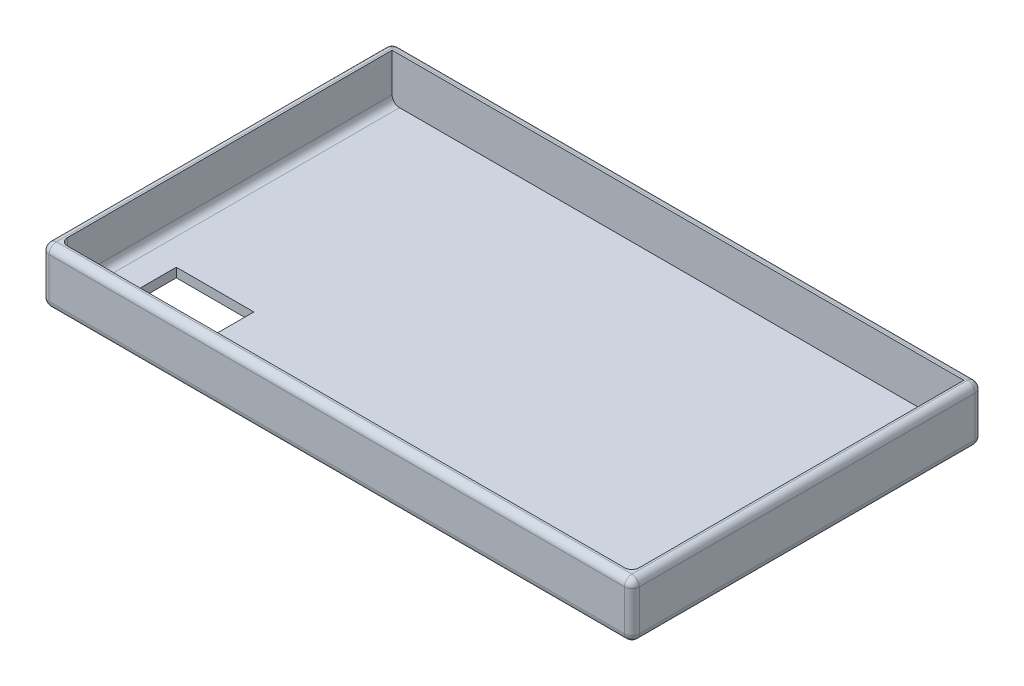
ISO-10303-21;
HEADER;
FILE_DESCRIPTION(('STEP AP214'),'2;1');
FILE_NAME('part.step','',(''),(''),'','','');
FILE_SCHEMA(('AUTOMOTIVE_DESIGN { 1 0 10303 214 1 1 1 1 }'));
ENDSEC;
DATA;
#1=APPLICATION_CONTEXT('core data for automotive mechanical design processes');
#2=APPLICATION_PROTOCOL_DEFINITION('international standard','automotive_design',2000,#1);
#3=PRODUCT_CONTEXT('',#1,'mechanical');
#4=PRODUCT('Part','Part','',(#3));
#5=PRODUCT_RELATED_PRODUCT_CATEGORY('part','',(#4));
#6=PRODUCT_DEFINITION_FORMATION('','',#4);
#7=PRODUCT_DEFINITION_CONTEXT('part definition',#1,'design');
#8=PRODUCT_DEFINITION('design','',#6,#7);
#9=PRODUCT_DEFINITION_SHAPE('','',#8);
#10=(LENGTH_UNIT() NAMED_UNIT(*) SI_UNIT(.MILLI.,.METRE.));
#11=(NAMED_UNIT(*) PLANE_ANGLE_UNIT() SI_UNIT($,.RADIAN.));
#12=(NAMED_UNIT(*) SI_UNIT($,.STERADIAN.) SOLID_ANGLE_UNIT());
#13=UNCERTAINTY_MEASURE_WITH_UNIT(LENGTH_MEASURE(1.E-05),#10,'distance_accuracy_value','');
#14=(GEOMETRIC_REPRESENTATION_CONTEXT(3) GLOBAL_UNCERTAINTY_ASSIGNED_CONTEXT((#13)) GLOBAL_UNIT_ASSIGNED_CONTEXT((#10,
#11,#12)) REPRESENTATION_CONTEXT('',''));
#15=CARTESIAN_POINT('',(0.,0.,0.));
#16=DIRECTION('',(0.,0.,1.));
#17=DIRECTION('',(1.,0.,0.));
#18=AXIS2_PLACEMENT_3D('',#15,#16,#17);
#19=CARTESIAN_POINT('',(0.,0.,0.));
#20=DIRECTION('',(0.,1.,0.));
#21=DIRECTION('',(0.,0.,1.));
#22=AXIS2_PLACEMENT_3D('',#19,#20,#21);
#23=PLANE('',#22);
#24=DIRECTION('',(0.,0.,-1.));
#25=VECTOR('',#24,1.);
#26=CARTESIAN_POINT('',(83.6859504132231,0.,0.));
#27=LINE('',#26,#25);
#28=CARTESIAN_POINT('',(83.6859504132231,0.,-42.4297520661157));
#29=VERTEX_POINT('',#28);
#30=CARTESIAN_POINT('',(83.6859504132231,0.,48.5702479338843));
#31=VERTEX_POINT('',#30);
#32=EDGE_CURVE('E284',#29,#31,#27,.F.);
#33=ORIENTED_EDGE('',*,*,#32,.T.);
#34=DIRECTION('',(1.,0.,0.));
#35=VECTOR('',#34,1.);
#36=CARTESIAN_POINT('',(0.,0.,48.5702479338843));
#37=LINE('',#36,#35);
#38=CARTESIAN_POINT('',(-72.3140495867769,0.,48.5702479338843));
#39=VERTEX_POINT('',#38);
#40=EDGE_CURVE('E292',#31,#39,#37,.F.);
#41=ORIENTED_EDGE('',*,*,#40,.T.);
#42=DIRECTION('',(0.,0.,1.));
#43=VECTOR('',#42,1.);
#44=CARTESIAN_POINT('',(-72.3140495867769,0.,0.));
#45=LINE('',#44,#43);
#46=CARTESIAN_POINT('',(-72.3140495867769,0.,-42.4297520661157));
#47=VERTEX_POINT('',#46);
#48=EDGE_CURVE('E288',#39,#47,#45,.F.);
#49=ORIENTED_EDGE('',*,*,#48,.T.);
#50=DIRECTION('',(-1.,0.,0.));
#51=VECTOR('',#50,1.);
#52=CARTESIAN_POINT('',(0.,0.,-42.4297520661157));
#53=LINE('',#52,#51);
#54=EDGE_CURVE('E290',#47,#29,#53,.F.);
#55=ORIENTED_EDGE('',*,*,#54,.T.);
#56=EDGE_LOOP('',(#33,#41,#49,#55));
#57=FACE_BOUND('',#56,.T.);
#58=DIRECTION('',(0.,0.,1.));
#59=VECTOR('',#58,1.);
#60=CARTESIAN_POINT('',(-62.6037619131865,0.,25.7770009158667));
#61=LINE('',#60,#59);
#62=CARTESIAN_POINT('',(-62.6037619131865,0.,25.7770009158667));
#63=VERTEX_POINT('',#62);
#64=CARTESIAN_POINT('',(-62.6037619131865,0.,38.7770009158667));
#65=VERTEX_POINT('',#64);
#66=EDGE_CURVE('E209',#63,#65,#61,.T.);
#67=ORIENTED_EDGE('',*,*,#66,.T.);
#68=DIRECTION('',(1.,0.,0.));
#69=VECTOR('',#68,1.);
#70=CARTESIAN_POINT('',(-62.6037619131865,0.,38.7770009158667));
#71=LINE('',#70,#69);
#72=CARTESIAN_POINT('',(-41.6037619131865,0.,38.7770009158667));
#73=VERTEX_POINT('',#72);
#74=EDGE_CURVE('E219',#65,#73,#71,.T.);
#75=ORIENTED_EDGE('',*,*,#74,.T.);
#76=DIRECTION('',(0.,0.,-1.));
#77=VECTOR('',#76,1.);
#78=CARTESIAN_POINT('',(-41.6037619131865,0.,25.7770009158667));
#79=LINE('',#78,#77);
#80=CARTESIAN_POINT('',(-41.6037619131865,0.,25.7770009158667));
#81=VERTEX_POINT('',#80);
#82=EDGE_CURVE('E228',#73,#81,#79,.T.);
#83=ORIENTED_EDGE('',*,*,#82,.T.);
#84=DIRECTION('',(-1.,0.,0.));
#85=VECTOR('',#84,1.);
#86=CARTESIAN_POINT('',(-62.6037619131865,0.,25.7770009158667));
#87=LINE('',#86,#85);
#88=EDGE_CURVE('E227',#81,#63,#87,.T.);
#89=ORIENTED_EDGE('',*,*,#88,.T.);
#90=EDGE_LOOP('',(#67,#75,#83,#89));
#91=FACE_BOUND('',#90,.T.);
#92=ADVANCED_FACE('F44',(#57,#91),#23,.F.);
#93=CARTESIAN_POINT('',(0.,2.5,0.));
#94=DIRECTION('',(0.,1.,0.));
#95=DIRECTION('',(0.,0.,1.));
#96=AXIS2_PLACEMENT_3D('',#93,#94,#95);
#97=PLANE('',#96);
#98=DIRECTION('',(1.,0.,0.));
#99=VECTOR('',#98,1.);
#100=CARTESIAN_POINT('',(83.1859504132231,2.5,46.0702479338843));
#101=LINE('',#100,#99);
#102=CARTESIAN_POINT('',(-69.8140495867769,2.5,46.0702479338843));
#103=VERTEX_POINT('',#102);
#104=CARTESIAN_POINT('',(81.1859504132231,2.5,46.0702479338843));
#105=VERTEX_POINT('',#104);
#106=EDGE_CURVE('E65',#103,#105,#101,.T.);
#107=ORIENTED_EDGE('',*,*,#106,.T.);
#108=DIRECTION('',(0.,0.,-1.));
#109=VECTOR('',#108,1.);
#110=CARTESIAN_POINT('',(81.1859504132231,2.5,-41.9297520661157));
#111=LINE('',#110,#109);
#112=CARTESIAN_POINT('',(81.1859504132231,2.5,-41.9297520661157));
#113=VERTEX_POINT('',#112);
#114=EDGE_CURVE('E66',#105,#113,#111,.T.);
#115=ORIENTED_EDGE('',*,*,#114,.T.);
#116=DIRECTION('',(-1.,0.,0.));
#117=VECTOR('',#116,1.);
#118=CARTESIAN_POINT('',(-74.3140495867769,2.5,-41.9297520661157));
#119=LINE('',#118,#117);
#120=CARTESIAN_POINT('',(-69.8140495867769,2.5,-41.9297520661157));
#121=VERTEX_POINT('',#120);
#122=EDGE_CURVE('E216',#113,#121,#119,.T.);
#123=ORIENTED_EDGE('',*,*,#122,.T.);
#124=DIRECTION('',(0.,0.,1.));
#125=VECTOR('',#124,1.);
#126=CARTESIAN_POINT('',(-69.8140495867769,2.5,48.0702479338843));
#127=LINE('',#126,#125);
#128=EDGE_CURVE('E357',#121,#103,#127,.T.);
#129=ORIENTED_EDGE('',*,*,#128,.T.);
#130=EDGE_LOOP('',(#107,#115,#123,#129));
#131=FACE_BOUND('',#130,.T.);
#132=DIRECTION('',(-1.,0.,0.));
#133=VECTOR('',#132,1.);
#134=CARTESIAN_POINT('',(0.,2.5,38.7770009158667));
#135=LINE('',#134,#133);
#136=CARTESIAN_POINT('',(-41.6037619131865,2.5,38.7770009158667));
#137=VERTEX_POINT('',#136);
#138=CARTESIAN_POINT('',(-62.6037619131865,2.5,38.7770009158667));
#139=VERTEX_POINT('',#138);
#140=EDGE_CURVE('E270',#137,#139,#135,.T.);
#141=ORIENTED_EDGE('',*,*,#140,.T.);
#142=DIRECTION('',(0.,0.,-1.));
#143=VECTOR('',#142,1.);
#144=CARTESIAN_POINT('',(-62.6037619131865,2.5,0.));
#145=LINE('',#144,#143);
#146=CARTESIAN_POINT('',(-62.6037619131865,2.5,25.7770009158667));
#147=VERTEX_POINT('',#146);
#148=EDGE_CURVE('E213',#139,#147,#145,.T.);
#149=ORIENTED_EDGE('',*,*,#148,.T.);
#150=DIRECTION('',(1.,0.,0.));
#151=VECTOR('',#150,1.);
#152=CARTESIAN_POINT('',(0.,2.5,25.7770009158667));
#153=LINE('',#152,#151);
#154=CARTESIAN_POINT('',(-41.6037619131865,2.5,25.7770009158667));
#155=VERTEX_POINT('',#154);
#156=EDGE_CURVE('E253',#147,#155,#153,.T.);
#157=ORIENTED_EDGE('',*,*,#156,.T.);
#158=DIRECTION('',(0.,0.,1.));
#159=VECTOR('',#158,1.);
#160=CARTESIAN_POINT('',(-41.6037619131865,2.5,0.));
#161=LINE('',#160,#159);
#162=EDGE_CURVE('E262',#155,#137,#161,.T.);
#163=ORIENTED_EDGE('',*,*,#162,.T.);
#164=EDGE_LOOP('',(#141,#149,#157,#163));
#165=FACE_BOUND('',#164,.T.);
#166=ADVANCED_FACE('F475',(#131,#165),#97,.T.);
#167=CARTESIAN_POINT('',(-74.3140495867769,15.,-44.4297520661157));
#168=DIRECTION('',(1.,0.,0.));
#169=DIRECTION('',(0.,0.,-1.));
#170=AXIS2_PLACEMENT_3D('',#167,#168,#169);
#171=PLANE('',#170);
#172=DIRECTION('',(0.,0.,1.));
#173=VECTOR('',#172,1.);
#174=CARTESIAN_POINT('',(-74.3140495867769,2.,-44.4297520661157));
#175=LINE('',#174,#173);
#176=CARTESIAN_POINT('',(-74.3140495867769,2.,-42.4297520661157));
#177=VERTEX_POINT('',#176);
#178=CARTESIAN_POINT('',(-74.3140495867769,2.,48.5702479338843));
#179=VERTEX_POINT('',#178);
#180=EDGE_CURVE('E280',#177,#179,#175,.T.);
#181=ORIENTED_EDGE('',*,*,#180,.T.);
#182=DIRECTION('',(0.,-1.,0.));
#183=VECTOR('',#182,1.);
#184=CARTESIAN_POINT('',(-74.3140495867769,15.,48.5702479338843));
#185=LINE('',#184,#183);
#186=CARTESIAN_POINT('',(-74.3140495867769,13.,48.5702479338843));
#187=VERTEX_POINT('',#186);
#188=EDGE_CURVE('E283',#179,#187,#185,.F.);
#189=ORIENTED_EDGE('',*,*,#188,.T.);
#190=DIRECTION('',(0.,0.,1.));
#191=VECTOR('',#190,1.);
#192=CARTESIAN_POINT('',(-74.3140495867769,13.,-44.4297520661157));
#193=LINE('',#192,#191);
#194=CARTESIAN_POINT('',(-74.3140495867769,13.,-42.4297520661157));
#195=VERTEX_POINT('',#194);
#196=EDGE_CURVE('E276',#187,#195,#193,.F.);
#197=ORIENTED_EDGE('',*,*,#196,.T.);
#198=DIRECTION('',(0.,-1.,0.));
#199=VECTOR('',#198,1.);
#200=CARTESIAN_POINT('',(-74.3140495867769,15.,-42.4297520661157));
#201=LINE('',#200,#199);
#202=EDGE_CURVE('E274',#195,#177,#201,.T.);
#203=ORIENTED_EDGE('',*,*,#202,.T.);
#204=EDGE_LOOP('',(#181,#189,#197,#203));
#205=FACE_BOUND('',#204,.T.);
#206=ADVANCED_FACE('F477',(#205),#171,.F.);
#207=CARTESIAN_POINT('',(-74.3140495867769,15.,50.5702479338843));
#208=DIRECTION('',(0.,0.,-1.));
#209=DIRECTION('',(-1.,0.,0.));
#210=AXIS2_PLACEMENT_3D('',#207,#208,#209);
#211=PLANE('',#210);
#212=DIRECTION('',(0.,-1.,0.));
#213=VECTOR('',#212,1.);
#214=CARTESIAN_POINT('',(83.6859504132231,15.,50.5702479338843));
#215=LINE('',#214,#213);
#216=CARTESIAN_POINT('',(83.6859504132231,2.,50.5702479338843));
#217=VERTEX_POINT('',#216);
#218=CARTESIAN_POINT('',(83.6859504132231,13.,50.5702479338843));
#219=VERTEX_POINT('',#218);
#220=EDGE_CURVE('E369',#217,#219,#215,.F.);
#221=ORIENTED_EDGE('',*,*,#220,.T.);
#222=DIRECTION('',(1.,0.,0.));
#223=VECTOR('',#222,1.);
#224=CARTESIAN_POINT('',(-72.3140495867769,13.,50.5702479338843));
#225=LINE('',#224,#223);
#226=CARTESIAN_POINT('',(-72.3140495867769,13.,50.5702479338843));
#227=VERTEX_POINT('',#226);
#228=EDGE_CURVE('E371',#219,#227,#225,.F.);
#229=ORIENTED_EDGE('',*,*,#228,.T.);
#230=DIRECTION('',(0.,-1.,0.));
#231=VECTOR('',#230,1.);
#232=CARTESIAN_POINT('',(-72.3140495867769,15.,50.5702479338843));
#233=LINE('',#232,#231);
#234=CARTESIAN_POINT('',(-72.3140495867769,2.,50.5702479338843));
#235=VERTEX_POINT('',#234);
#236=EDGE_CURVE('E272',#227,#235,#233,.T.);
#237=ORIENTED_EDGE('',*,*,#236,.T.);
#238=DIRECTION('',(1.,0.,0.));
#239=VECTOR('',#238,1.);
#240=CARTESIAN_POINT('',(-74.3140495867769,2.,50.5702479338843));
#241=LINE('',#240,#239);
#242=EDGE_CURVE('E269',#235,#217,#241,.T.);
#243=ORIENTED_EDGE('',*,*,#242,.T.);
#244=EDGE_LOOP('',(#221,#229,#237,#243));
#245=FACE_BOUND('',#244,.T.);
#246=ADVANCED_FACE('F491',(#245),#211,.F.);
#247=CARTESIAN_POINT('',(85.6859504132231,15.,-44.4297520661157));
#248=DIRECTION('',(-1.,0.,0.));
#249=DIRECTION('',(0.,0.,1.));
#250=AXIS2_PLACEMENT_3D('',#247,#248,#249);
#251=PLANE('',#250);
#252=DIRECTION('',(0.,0.,-1.));
#253=VECTOR('',#252,1.);
#254=CARTESIAN_POINT('',(85.6859504132231,13.,50.5702479338843));
#255=LINE('',#254,#253);
#256=CARTESIAN_POINT('',(85.6859504132231,13.,-42.4297520661157));
#257=VERTEX_POINT('',#256);
#258=CARTESIAN_POINT('',(85.6859504132231,13.,48.5702479338843));
#259=VERTEX_POINT('',#258);
#260=EDGE_CURVE('E373',#257,#259,#255,.F.);
#261=ORIENTED_EDGE('',*,*,#260,.T.);
#262=DIRECTION('',(0.,-1.,0.));
#263=VECTOR('',#262,1.);
#264=CARTESIAN_POINT('',(85.6859504132231,15.,48.5702479338843));
#265=LINE('',#264,#263);
#266=CARTESIAN_POINT('',(85.6859504132231,2.,48.5702479338843));
#267=VERTEX_POINT('',#266);
#268=EDGE_CURVE('E374',#259,#267,#265,.T.);
#269=ORIENTED_EDGE('',*,*,#268,.T.);
#270=DIRECTION('',(0.,0.,-1.));
#271=VECTOR('',#270,1.);
#272=CARTESIAN_POINT('',(85.6859504132231,2.,-44.4297520661157));
#273=LINE('',#272,#271);
#274=CARTESIAN_POINT('',(85.6859504132231,2.,-42.4297520661157));
#275=VERTEX_POINT('',#274);
#276=EDGE_CURVE('E310',#267,#275,#273,.T.);
#277=ORIENTED_EDGE('',*,*,#276,.T.);
#278=DIRECTION('',(0.,-1.,0.));
#279=VECTOR('',#278,1.);
#280=CARTESIAN_POINT('',(85.6859504132231,15.,-42.4297520661157));
#281=LINE('',#280,#279);
#282=EDGE_CURVE('E313',#275,#257,#281,.F.);
#283=ORIENTED_EDGE('',*,*,#282,.T.);
#284=EDGE_LOOP('',(#261,#269,#277,#283));
#285=FACE_BOUND('',#284,.T.);
#286=ADVANCED_FACE('F490',(#285),#251,.F.);
#287=CARTESIAN_POINT('',(-74.3140495867769,15.,-44.4297520661157));
#288=DIRECTION('',(0.,0.,1.));
#289=DIRECTION('',(1.,0.,0.));
#290=AXIS2_PLACEMENT_3D('',#287,#288,#289);
#291=PLANE('',#290);
#292=DIRECTION('',(-1.,0.,0.));
#293=VECTOR('',#292,1.);
#294=CARTESIAN_POINT('',(-74.3140495867769,2.,-44.4297520661157));
#295=LINE('',#294,#293);
#296=CARTESIAN_POINT('',(83.6859504132231,2.,-44.4297520661157));
#297=VERTEX_POINT('',#296);
#298=CARTESIAN_POINT('',(-72.3140495867769,2.,-44.4297520661157));
#299=VERTEX_POINT('',#298);
#300=EDGE_CURVE('E299',#297,#299,#295,.T.);
#301=ORIENTED_EDGE('',*,*,#300,.T.);
#302=DIRECTION('',(0.,-1.,0.));
#303=VECTOR('',#302,1.);
#304=CARTESIAN_POINT('',(-72.3140495867769,15.,-44.4297520661157));
#305=LINE('',#304,#303);
#306=CARTESIAN_POINT('',(-72.3140495867769,13.,-44.4297520661157));
#307=VERTEX_POINT('',#306);
#308=EDGE_CURVE('E308',#299,#307,#305,.F.);
#309=ORIENTED_EDGE('',*,*,#308,.T.);
#310=DIRECTION('',(-1.,0.,0.));
#311=VECTOR('',#310,1.);
#312=CARTESIAN_POINT('',(85.6859504132231,13.,-44.4297520661157));
#313=LINE('',#312,#311);
#314=CARTESIAN_POINT('',(83.6859504132231,13.,-44.4297520661157));
#315=VERTEX_POINT('',#314);
#316=EDGE_CURVE('E302',#307,#315,#313,.F.);
#317=ORIENTED_EDGE('',*,*,#316,.T.);
#318=DIRECTION('',(0.,-1.,0.));
#319=VECTOR('',#318,1.);
#320=CARTESIAN_POINT('',(83.6859504132231,15.,-44.4297520661157));
#321=LINE('',#320,#319);
#322=EDGE_CURVE('E301',#315,#297,#321,.T.);
#323=ORIENTED_EDGE('',*,*,#322,.T.);
#324=EDGE_LOOP('',(#301,#309,#317,#323));
#325=FACE_BOUND('',#324,.T.);
#326=ADVANCED_FACE('F482',(#325),#291,.F.);
#327=CARTESIAN_POINT('',(0.,15.,0.));
#328=DIRECTION('',(0.,1.,0.));
#329=DIRECTION('',(0.,0.,1.));
#330=AXIS2_PLACEMENT_3D('',#327,#328,#329);
#331=PLANE('',#330);
#332=DIRECTION('',(0.,0.,1.));
#333=VECTOR('',#332,1.);
#334=CARTESIAN_POINT('',(-71.8140495867769,15.,-44.4297520661157));
#335=LINE('',#334,#333);
#336=CARTESIAN_POINT('',(-71.8140495867769,15.,-41.9297520661157));
#337=VERTEX_POINT('',#336);
#338=CARTESIAN_POINT('',(-71.8140495867769,15.,46.0702479338843));
#339=VERTEX_POINT('',#338);
#340=EDGE_CURVE('E251',#337,#339,#335,.T.);
#341=ORIENTED_EDGE('',*,*,#340,.F.);
#342=DIRECTION('',(-1.,0.,0.));
#343=VECTOR('',#342,1.);
#344=CARTESIAN_POINT('',(-74.3140495867769,15.,-41.9297520661157));
#345=LINE('',#344,#343);
#346=CARTESIAN_POINT('',(83.1859504132231,15.,-41.9297520661157));
#347=VERTEX_POINT('',#346);
#348=EDGE_CURVE('E247',#347,#337,#345,.T.);
#349=ORIENTED_EDGE('',*,*,#348,.F.);
#350=DIRECTION('',(0.,0.,-1.));
#351=VECTOR('',#350,1.);
#352=CARTESIAN_POINT('',(83.1859504132231,15.,-44.4297520661157));
#353=LINE('',#352,#351);
#354=CARTESIAN_POINT('',(83.1859504132231,15.,46.0702479338843));
#355=VERTEX_POINT('',#354);
#356=EDGE_CURVE('E259',#355,#347,#353,.T.);
#357=ORIENTED_EDGE('',*,*,#356,.F.);
#358=CARTESIAN_POINT('',(81.1859504132231,15.,46.0702479338843));
#359=DIRECTION('',(0.,1.,0.));
#360=DIRECTION('',(0.,0.,1.));
#361=AXIS2_PLACEMENT_3D('',#358,#359,#360);
#362=CIRCLE('',#361,2.);
#363=CARTESIAN_POINT('',(81.1859504132231,15.,48.0702479338843));
#364=VERTEX_POINT('',#363);
#365=EDGE_CURVE('E11',#355,#364,#362,.F.);
#366=ORIENTED_EDGE('',*,*,#365,.T.);
#367=DIRECTION('',(1.,0.,0.));
#368=VECTOR('',#367,1.);
#369=CARTESIAN_POINT('',(-74.3140495867769,15.,48.0702479338843));
#370=LINE('',#369,#368);
#371=CARTESIAN_POINT('',(-69.8140495867769,15.,48.0702479338843));
#372=VERTEX_POINT('',#371);
#373=EDGE_CURVE('E258',#372,#364,#370,.T.);
#374=ORIENTED_EDGE('',*,*,#373,.F.);
#375=CARTESIAN_POINT('',(-69.8140495867769,15.,46.0702479338843));
#376=DIRECTION('',(0.,1.,0.));
#377=DIRECTION('',(0.,0.,1.));
#378=AXIS2_PLACEMENT_3D('',#375,#376,#377);
#379=CIRCLE('',#378,2.);
#380=EDGE_CURVE('E53',#372,#339,#379,.F.);
#381=ORIENTED_EDGE('',*,*,#380,.T.);
#382=EDGE_LOOP('',(#341,#349,#357,#366,#374,#381));
#383=FACE_BOUND('',#382,.T.);
#384=DIRECTION('',(0.,0.,1.));
#385=VECTOR('',#384,1.);
#386=CARTESIAN_POINT('',(-72.3140495867769,15.,50.5702479338843));
#387=LINE('',#386,#385);
#388=CARTESIAN_POINT('',(-72.3140495867769,15.,-42.4297520661157));
#389=VERTEX_POINT('',#388);
#390=CARTESIAN_POINT('',(-72.3140495867769,15.,48.5702479338843));
#391=VERTEX_POINT('',#390);
#392=EDGE_CURVE('E298',#389,#391,#387,.T.);
#393=ORIENTED_EDGE('',*,*,#392,.T.);
#394=DIRECTION('',(1.,0.,0.));
#395=VECTOR('',#394,1.);
#396=CARTESIAN_POINT('',(85.6859504132231,15.,48.5702479338843));
#397=LINE('',#396,#395);
#398=CARTESIAN_POINT('',(83.6859504132231,15.,48.5702479338843));
#399=VERTEX_POINT('',#398);
#400=EDGE_CURVE('E370',#391,#399,#397,.T.);
#401=ORIENTED_EDGE('',*,*,#400,.T.);
#402=DIRECTION('',(0.,0.,-1.));
#403=VECTOR('',#402,1.);
#404=CARTESIAN_POINT('',(83.6859504132231,15.,-42.4297520661157));
#405=LINE('',#404,#403);
#406=CARTESIAN_POINT('',(83.6859504132231,15.,-42.4297520661157));
#407=VERTEX_POINT('',#406);
#408=EDGE_CURVE('E364',#399,#407,#405,.T.);
#409=ORIENTED_EDGE('',*,*,#408,.T.);
#410=DIRECTION('',(-1.,0.,0.));
#411=VECTOR('',#410,1.);
#412=CARTESIAN_POINT('',(-74.3140495867769,15.,-42.4297520661157));
#413=LINE('',#412,#411);
#414=EDGE_CURVE('E294',#407,#389,#413,.T.);
#415=ORIENTED_EDGE('',*,*,#414,.T.);
#416=EDGE_LOOP('',(#393,#401,#409,#415));
#417=FACE_BOUND('',#416,.T.);
#418=ADVANCED_FACE('F451',(#383,#417),#331,.T.);
#419=CARTESIAN_POINT('',(-71.8140495867769,15.,-44.4297520661157));
#420=DIRECTION('',(1.,0.,0.));
#421=DIRECTION('',(0.,0.,-1.));
#422=AXIS2_PLACEMENT_3D('',#419,#420,#421);
#423=PLANE('',#422);
#424=ORIENTED_EDGE('',*,*,#340,.T.);
#425=DIRECTION('',(0.,-1.,0.));
#426=VECTOR('',#425,1.);
#427=CARTESIAN_POINT('',(-71.8140495867769,4.5,46.0702479338843));
#428=LINE('',#427,#426);
#429=CARTESIAN_POINT('',(-71.8140495867769,4.5,46.0702479338843));
#430=VERTEX_POINT('',#429);
#431=EDGE_CURVE('E380',#339,#430,#428,.T.);
#432=ORIENTED_EDGE('',*,*,#431,.T.);
#433=DIRECTION('',(0.,0.,1.));
#434=VECTOR('',#433,1.);
#435=CARTESIAN_POINT('',(-71.8140495867769,4.5,-41.9297520661157));
#436=LINE('',#435,#434);
#437=CARTESIAN_POINT('',(-71.8140495867769,4.5,-41.9297520661157));
#438=VERTEX_POINT('',#437);
#439=EDGE_CURVE('E359',#430,#438,#436,.F.);
#440=ORIENTED_EDGE('',*,*,#439,.T.);
#441=DIRECTION('',(0.,-1.,0.));
#442=VECTOR('',#441,1.);
#443=CARTESIAN_POINT('',(-71.8140495867769,15.,-41.9297520661157));
#444=LINE('',#443,#442);
#445=EDGE_CURVE('E244',#337,#438,#444,.T.);
#446=ORIENTED_EDGE('',*,*,#445,.F.);
#447=EDGE_LOOP('',(#424,#432,#440,#446));
#448=FACE_BOUND('',#447,.T.);
#449=ADVANCED_FACE('F456',(#448),#423,.T.);
#450=CARTESIAN_POINT('',(-74.3140495867769,15.,48.0702479338843));
#451=DIRECTION('',(0.,0.,-1.));
#452=DIRECTION('',(-1.,0.,0.));
#453=AXIS2_PLACEMENT_3D('',#450,#451,#452);
#454=PLANE('',#453);
#455=DIRECTION('',(1.,0.,0.));
#456=VECTOR('',#455,1.);
#457=CARTESIAN_POINT('',(-69.8140495867769,4.5,48.0702479338843));
#458=LINE('',#457,#456);
#459=CARTESIAN_POINT('',(81.1859504132231,4.5,48.0702479338843));
#460=VERTEX_POINT('',#459);
#461=CARTESIAN_POINT('',(-69.8140495867769,4.5,48.0702479338843));
#462=VERTEX_POINT('',#461);
#463=EDGE_CURVE('E400',#460,#462,#458,.F.);
#464=ORIENTED_EDGE('',*,*,#463,.T.);
#465=DIRECTION('',(0.,-1.,0.));
#466=VECTOR('',#465,1.);
#467=CARTESIAN_POINT('',(-69.8140495867769,15.,48.0702479338843));
#468=LINE('',#467,#466);
#469=EDGE_CURVE('E402',#462,#372,#468,.F.);
#470=ORIENTED_EDGE('',*,*,#469,.T.);
#471=ORIENTED_EDGE('',*,*,#373,.T.);
#472=DIRECTION('',(0.,-1.,0.));
#473=VECTOR('',#472,1.);
#474=CARTESIAN_POINT('',(81.1859504132231,2.5,48.0702479338843));
#475=LINE('',#474,#473);
#476=EDGE_CURVE('E398',#364,#460,#475,.T.);
#477=ORIENTED_EDGE('',*,*,#476,.T.);
#478=EDGE_LOOP('',(#464,#470,#471,#477));
#479=FACE_BOUND('',#478,.T.);
#480=ADVANCED_FACE('F440',(#479),#454,.T.);
#481=CARTESIAN_POINT('',(83.1859504132231,15.,-44.4297520661157));
#482=DIRECTION('',(-1.,0.,0.));
#483=DIRECTION('',(0.,0.,1.));
#484=AXIS2_PLACEMENT_3D('',#481,#482,#483);
#485=PLANE('',#484);
#486=DIRECTION('',(0.,0.,-1.));
#487=VECTOR('',#486,1.);
#488=CARTESIAN_POINT('',(83.1859504132231,4.5,48.0702479338843));
#489=LINE('',#488,#487);
#490=CARTESIAN_POINT('',(83.1859504132231,4.5,-41.9297520661157));
#491=VERTEX_POINT('',#490);
#492=CARTESIAN_POINT('',(83.1859504132231,4.5,46.0702479338843));
#493=VERTEX_POINT('',#492);
#494=EDGE_CURVE('E403',#491,#493,#489,.F.);
#495=ORIENTED_EDGE('',*,*,#494,.T.);
#496=DIRECTION('',(0.,-1.,0.));
#497=VECTOR('',#496,1.);
#498=CARTESIAN_POINT('',(83.1859504132231,15.,46.0702479338843));
#499=LINE('',#498,#497);
#500=EDGE_CURVE('E410',#493,#355,#499,.F.);
#501=ORIENTED_EDGE('',*,*,#500,.T.);
#502=ORIENTED_EDGE('',*,*,#356,.T.);
#503=DIRECTION('',(0.,-1.,0.));
#504=VECTOR('',#503,1.);
#505=CARTESIAN_POINT('',(83.1859504132231,15.,-41.9297520661157));
#506=LINE('',#505,#504);
#507=EDGE_CURVE('E250',#347,#491,#506,.T.);
#508=ORIENTED_EDGE('',*,*,#507,.T.);
#509=EDGE_LOOP('',(#495,#501,#502,#508));
#510=FACE_BOUND('',#509,.T.);
#511=ADVANCED_FACE('F448',(#510),#485,.T.);
#512=CARTESIAN_POINT('',(-74.3140495867769,15.,-41.9297520661157));
#513=DIRECTION('',(0.,0.,1.));
#514=DIRECTION('',(1.,0.,0.));
#515=AXIS2_PLACEMENT_3D('',#512,#513,#514);
#516=PLANE('',#515);
#517=ORIENTED_EDGE('',*,*,#122,.F.);
#518=CARTESIAN_POINT('',(81.1859504132231,4.5,-41.9297520661157));
#519=DIRECTION('',(0.,0.,1.));
#520=DIRECTION('',(1.,0.,0.));
#521=AXIS2_PLACEMENT_3D('',#518,#519,#520);
#522=CIRCLE('',#521,2.);
#523=EDGE_CURVE('E411',#113,#491,#522,.T.);
#524=ORIENTED_EDGE('',*,*,#523,.T.);
#525=ORIENTED_EDGE('',*,*,#507,.F.);
#526=ORIENTED_EDGE('',*,*,#348,.T.);
#527=ORIENTED_EDGE('',*,*,#445,.T.);
#528=CARTESIAN_POINT('',(-69.8140495867769,4.5,-41.9297520661157));
#529=DIRECTION('',(0.,0.,1.));
#530=DIRECTION('',(1.,0.,0.));
#531=AXIS2_PLACEMENT_3D('',#528,#529,#530);
#532=CIRCLE('',#531,2.);
#533=EDGE_CURVE('E362',#438,#121,#532,.T.);
#534=ORIENTED_EDGE('',*,*,#533,.T.);
#535=EDGE_LOOP('',(#517,#524,#525,#526,#527,#534));
#536=FACE_BOUND('',#535,.T.);
#537=ADVANCED_FACE('F454',(#536),#516,.T.);
#538=CARTESIAN_POINT('',(-62.6037619131865,15.,25.7770009158667));
#539=DIRECTION('',(1.,0.,0.));
#540=DIRECTION('',(0.,0.,-1.));
#541=AXIS2_PLACEMENT_3D('',#538,#539,#540);
#542=PLANE('',#541);
#543=DIRECTION('',(0.,-1.,0.));
#544=VECTOR('',#543,1.);
#545=CARTESIAN_POINT('',(-62.6037619131865,15.,38.7770009158667));
#546=LINE('',#545,#544);
#547=EDGE_CURVE('E202',#139,#65,#546,.T.);
#548=ORIENTED_EDGE('',*,*,#547,.T.);
#549=ORIENTED_EDGE('',*,*,#66,.F.);
#550=DIRECTION('',(0.,-1.,0.));
#551=VECTOR('',#550,1.);
#552=CARTESIAN_POINT('',(-62.6037619131865,15.,25.7770009158667));
#553=LINE('',#552,#551);
#554=EDGE_CURVE('E239',#147,#63,#553,.T.);
#555=ORIENTED_EDGE('',*,*,#554,.F.);
#556=ORIENTED_EDGE('',*,*,#148,.F.);
#557=EDGE_LOOP('',(#548,#549,#555,#556));
#558=FACE_BOUND('',#557,.T.);
#559=ADVANCED_FACE('F210',(#558),#542,.T.);
#560=CARTESIAN_POINT('',(-62.6037619131865,15.,38.7770009158667));
#561=DIRECTION('',(0.,0.,-1.));
#562=DIRECTION('',(-1.,0.,0.));
#563=AXIS2_PLACEMENT_3D('',#560,#561,#562);
#564=PLANE('',#563);
#565=DIRECTION('',(0.,-1.,0.));
#566=VECTOR('',#565,1.);
#567=CARTESIAN_POINT('',(-41.6037619131865,15.,38.7770009158667));
#568=LINE('',#567,#566);
#569=EDGE_CURVE('E220',#137,#73,#568,.T.);
#570=ORIENTED_EDGE('',*,*,#569,.T.);
#571=ORIENTED_EDGE('',*,*,#74,.F.);
#572=ORIENTED_EDGE('',*,*,#547,.F.);
#573=ORIENTED_EDGE('',*,*,#140,.F.);
#574=EDGE_LOOP('',(#570,#571,#572,#573));
#575=FACE_BOUND('',#574,.T.);
#576=ADVANCED_FACE('F222',(#575),#564,.T.);
#577=CARTESIAN_POINT('',(-41.6037619131865,15.,25.7770009158667));
#578=DIRECTION('',(-1.,0.,0.));
#579=DIRECTION('',(0.,0.,1.));
#580=AXIS2_PLACEMENT_3D('',#577,#578,#579);
#581=PLANE('',#580);
#582=DIRECTION('',(0.,-1.,0.));
#583=VECTOR('',#582,1.);
#584=CARTESIAN_POINT('',(-41.6037619131865,15.,25.7770009158667));
#585=LINE('',#584,#583);
#586=EDGE_CURVE('E243',#155,#81,#585,.T.);
#587=ORIENTED_EDGE('',*,*,#586,.T.);
#588=ORIENTED_EDGE('',*,*,#82,.F.);
#589=ORIENTED_EDGE('',*,*,#569,.F.);
#590=ORIENTED_EDGE('',*,*,#162,.F.);
#591=EDGE_LOOP('',(#587,#588,#589,#590));
#592=FACE_BOUND('',#591,.T.);
#593=ADVANCED_FACE('F912',(#592),#581,.T.);
#594=CARTESIAN_POINT('',(-62.6037619131865,15.,25.7770009158667));
#595=DIRECTION('',(0.,0.,1.));
#596=DIRECTION('',(1.,0.,0.));
#597=AXIS2_PLACEMENT_3D('',#594,#595,#596);
#598=PLANE('',#597);
#599=ORIENTED_EDGE('',*,*,#554,.T.);
#600=ORIENTED_EDGE('',*,*,#88,.F.);
#601=ORIENTED_EDGE('',*,*,#586,.F.);
#602=ORIENTED_EDGE('',*,*,#156,.F.);
#603=EDGE_LOOP('',(#599,#600,#601,#602));
#604=FACE_BOUND('',#603,.T.);
#605=ADVANCED_FACE('F552',(#604),#598,.T.);
#606=CARTESIAN_POINT('',(83.6859504132231,15.,-42.4297520661157));
#607=DIRECTION('',(0.,-1.,0.));
#608=DIRECTION('',(0.,0.,-1.));
#609=AXIS2_PLACEMENT_3D('',#606,#607,#608);
#610=CYLINDRICAL_SURFACE('',#609,2.);
#611=ORIENTED_EDGE('',*,*,#322,.F.);
#612=CARTESIAN_POINT('',(83.6859504132231,13.,-42.4297520661157));
#613=DIRECTION('',(0.,-1.,0.));
#614=DIRECTION('',(0.,0.,-1.));
#615=AXIS2_PLACEMENT_3D('',#612,#613,#614);
#616=CIRCLE('',#615,2.);
#617=EDGE_CURVE('E356',#315,#257,#616,.T.);
#618=ORIENTED_EDGE('',*,*,#617,.T.);
#619=ORIENTED_EDGE('',*,*,#282,.F.);
#620=CARTESIAN_POINT('',(83.6859504132231,2.,-42.4297520661157));
#621=DIRECTION('',(0.,-1.,0.));
#622=DIRECTION('',(0.,0.,-1.));
#623=AXIS2_PLACEMENT_3D('',#620,#621,#622);
#624=CIRCLE('',#623,2.);
#625=EDGE_CURVE('E231',#297,#275,#624,.T.);
#626=ORIENTED_EDGE('',*,*,#625,.F.);
#627=EDGE_LOOP('',(#611,#618,#619,#626));
#628=FACE_BOUND('',#627,.T.);
#629=ADVANCED_FACE('F550',(#628),#610,.T.);
#630=CARTESIAN_POINT('',(83.6859504132231,2.,-42.4297520661157));
#631=DIRECTION('',(0.,0.,-1.));
#632=DIRECTION('',(-1.,0.,0.));
#633=AXIS2_PLACEMENT_3D('',#630,#631,#632);
#634=SPHERICAL_SURFACE('',#633,2.);
#635=CARTESIAN_POINT('',(83.6859504132231,2.,-42.4297520661157));
#636=DIRECTION('',(0.,0.,-1.));
#637=DIRECTION('',(-1.,0.,0.));
#638=AXIS2_PLACEMENT_3D('',#635,#636,#637);
#639=CIRCLE('',#638,2.);
#640=EDGE_CURVE('E341',#29,#275,#639,.F.);
#641=ORIENTED_EDGE('',*,*,#640,.F.);
#642=CARTESIAN_POINT('',(83.6859504132231,2.,-42.4297520661157));
#643=DIRECTION('',(1.,0.,0.));
#644=DIRECTION('',(0.,0.,-1.));
#645=AXIS2_PLACEMENT_3D('',#642,#643,#644);
#646=CIRCLE('',#645,2.);
#647=EDGE_CURVE('E233',#297,#29,#646,.F.);
#648=ORIENTED_EDGE('',*,*,#647,.F.);
#649=ORIENTED_EDGE('',*,*,#625,.T.);
#650=EDGE_LOOP('',(#641,#648,#649));
#651=FACE_BOUND('',#650,.T.);
#652=ADVANCED_FACE('F543',(#651),#634,.T.);
#653=CARTESIAN_POINT('',(-74.3140495867769,2.,-42.4297520661157));
#654=DIRECTION('',(-1.,0.,0.));
#655=DIRECTION('',(0.,0.,1.));
#656=AXIS2_PLACEMENT_3D('',#653,#654,#655);
#657=CYLINDRICAL_SURFACE('',#656,2.);
#658=ORIENTED_EDGE('',*,*,#647,.T.);
#659=ORIENTED_EDGE('',*,*,#54,.F.);
#660=CARTESIAN_POINT('',(-72.3140495867769,2.,-42.4297520661157));
#661=DIRECTION('',(-1.,0.,0.));
#662=DIRECTION('',(0.,0.,1.));
#663=AXIS2_PLACEMENT_3D('',#660,#661,#662);
#664=CIRCLE('',#663,2.);
#665=EDGE_CURVE('E336',#299,#47,#664,.T.);
#666=ORIENTED_EDGE('',*,*,#665,.F.);
#667=ORIENTED_EDGE('',*,*,#300,.F.);
#668=EDGE_LOOP('',(#658,#659,#666,#667));
#669=FACE_BOUND('',#668,.T.);
#670=ADVANCED_FACE('F537',(#669),#657,.T.);
#671=CARTESIAN_POINT('',(-72.3140495867769,15.,-42.4297520661157));
#672=DIRECTION('',(0.,-1.,0.));
#673=DIRECTION('',(0.,0.,-1.));
#674=AXIS2_PLACEMENT_3D('',#671,#672,#673);
#675=CYLINDRICAL_SURFACE('',#674,2.);
#676=CARTESIAN_POINT('',(-72.3140495867769,13.,-42.4297520661157));
#677=DIRECTION('',(0.,1.,0.));
#678=DIRECTION('',(0.,0.,1.));
#679=AXIS2_PLACEMENT_3D('',#676,#677,#678);
#680=CIRCLE('',#679,2.);
#681=EDGE_CURVE('E335',#307,#195,#680,.T.);
#682=ORIENTED_EDGE('',*,*,#681,.F.);
#683=ORIENTED_EDGE('',*,*,#308,.F.);
#684=CARTESIAN_POINT('',(-72.3140495867769,2.,-42.4297520661157));
#685=DIRECTION('',(0.,-1.,0.));
#686=DIRECTION('',(0.,0.,-1.));
#687=AXIS2_PLACEMENT_3D('',#684,#685,#686);
#688=CIRCLE('',#687,2.);
#689=EDGE_CURVE('E333',#177,#299,#688,.T.);
#690=ORIENTED_EDGE('',*,*,#689,.F.);
#691=ORIENTED_EDGE('',*,*,#202,.F.);
#692=EDGE_LOOP('',(#682,#683,#690,#691));
#693=FACE_BOUND('',#692,.T.);
#694=ADVANCED_FACE('F532',(#693),#675,.T.);
#695=CARTESIAN_POINT('',(0.,13.,-42.4297520661157));
#696=DIRECTION('',(1.,0.,0.));
#697=DIRECTION('',(0.,0.,-1.));
#698=AXIS2_PLACEMENT_3D('',#695,#696,#697);
#699=CYLINDRICAL_SURFACE('',#698,2.);
#700=ORIENTED_EDGE('',*,*,#414,.F.);
#701=CARTESIAN_POINT('',(83.6859504132231,13.,-42.4297520661157));
#702=DIRECTION('',(1.,0.,0.));
#703=DIRECTION('',(0.,0.,-1.));
#704=AXIS2_PLACEMENT_3D('',#701,#702,#703);
#705=CIRCLE('',#704,2.);
#706=EDGE_CURVE('E354',#407,#315,#705,.F.);
#707=ORIENTED_EDGE('',*,*,#706,.T.);
#708=ORIENTED_EDGE('',*,*,#316,.F.);
#709=CARTESIAN_POINT('',(-72.3140495867769,13.,-42.4297520661157));
#710=DIRECTION('',(-1.,0.,0.));
#711=DIRECTION('',(0.,0.,1.));
#712=AXIS2_PLACEMENT_3D('',#709,#710,#711);
#713=CIRCLE('',#712,2.);
#714=EDGE_CURVE('E329',#389,#307,#713,.T.);
#715=ORIENTED_EDGE('',*,*,#714,.F.);
#716=EDGE_LOOP('',(#700,#707,#708,#715));
#717=FACE_BOUND('',#716,.T.);
#718=ADVANCED_FACE('F533',(#717),#699,.T.);
#719=CARTESIAN_POINT('',(83.6859504132231,2.,-44.4297520661157));
#720=DIRECTION('',(0.,0.,-1.));
#721=DIRECTION('',(-1.,0.,0.));
#722=AXIS2_PLACEMENT_3D('',#719,#720,#721);
#723=CYLINDRICAL_SURFACE('',#722,2.);
#724=ORIENTED_EDGE('',*,*,#276,.F.);
#725=CARTESIAN_POINT('',(83.6859504132231,2.,48.5702479338843));
#726=DIRECTION('',(0.,0.,-1.));
#727=DIRECTION('',(-1.,0.,0.));
#728=AXIS2_PLACEMENT_3D('',#725,#726,#727);
#729=CIRCLE('',#728,2.);
#730=EDGE_CURVE('E355',#267,#31,#729,.T.);
#731=ORIENTED_EDGE('',*,*,#730,.T.);
#732=ORIENTED_EDGE('',*,*,#32,.F.);
#733=ORIENTED_EDGE('',*,*,#640,.T.);
#734=EDGE_LOOP('',(#724,#731,#732,#733));
#735=FACE_BOUND('',#734,.T.);
#736=ADVANCED_FACE('F527',(#735),#723,.T.);
#737=CARTESIAN_POINT('',(-72.3140495867769,2.,-42.4297520661157));
#738=DIRECTION('',(0.,0.,-1.));
#739=DIRECTION('',(-1.,0.,0.));
#740=AXIS2_PLACEMENT_3D('',#737,#738,#739);
#741=SPHERICAL_SURFACE('',#740,2.);
#742=ORIENTED_EDGE('',*,*,#689,.T.);
#743=ORIENTED_EDGE('',*,*,#665,.T.);
#744=CARTESIAN_POINT('',(-72.3140495867769,2.,-42.4297520661157));
#745=DIRECTION('',(0.,0.,-1.));
#746=DIRECTION('',(-1.,0.,0.));
#747=AXIS2_PLACEMENT_3D('',#744,#745,#746);
#748=CIRCLE('',#747,2.);
#749=EDGE_CURVE('E330',#177,#47,#748,.F.);
#750=ORIENTED_EDGE('',*,*,#749,.F.);
#751=EDGE_LOOP('',(#742,#743,#750));
#752=FACE_BOUND('',#751,.T.);
#753=ADVANCED_FACE('F522',(#752),#741,.T.);
#754=CARTESIAN_POINT('',(-72.3140495867769,13.,-42.4297520661157));
#755=DIRECTION('',(0.,0.,-1.));
#756=DIRECTION('',(-1.,0.,0.));
#757=AXIS2_PLACEMENT_3D('',#754,#755,#756);
#758=SPHERICAL_SURFACE('',#757,2.);
#759=ORIENTED_EDGE('',*,*,#714,.T.);
#760=ORIENTED_EDGE('',*,*,#681,.T.);
#761=CARTESIAN_POINT('',(-72.3140495867769,13.,-42.4297520661157));
#762=DIRECTION('',(0.,0.,-1.));
#763=DIRECTION('',(-1.,0.,0.));
#764=AXIS2_PLACEMENT_3D('',#761,#762,#763);
#765=CIRCLE('',#764,2.);
#766=EDGE_CURVE('E322',#389,#195,#765,.F.);
#767=ORIENTED_EDGE('',*,*,#766,.F.);
#768=EDGE_LOOP('',(#759,#760,#767));
#769=FACE_BOUND('',#768,.T.);
#770=ADVANCED_FACE('F519',(#769),#758,.T.);
#771=CARTESIAN_POINT('',(-74.3140495867769,2.,48.5702479338843));
#772=DIRECTION('',(1.,0.,0.));
#773=DIRECTION('',(0.,0.,-1.));
#774=AXIS2_PLACEMENT_3D('',#771,#772,#773);
#775=CYLINDRICAL_SURFACE('',#774,2.);
#776=ORIENTED_EDGE('',*,*,#40,.F.);
#777=CARTESIAN_POINT('',(83.6859504132231,2.,48.5702479338843));
#778=DIRECTION('',(1.,0.,0.));
#779=DIRECTION('',(0.,0.,-1.));
#780=AXIS2_PLACEMENT_3D('',#777,#778,#779);
#781=CIRCLE('',#780,2.);
#782=EDGE_CURVE('E348',#31,#217,#781,.F.);
#783=ORIENTED_EDGE('',*,*,#782,.T.);
#784=ORIENTED_EDGE('',*,*,#242,.F.);
#785=CARTESIAN_POINT('',(-72.3140495867769,2.,48.5702479338843));
#786=DIRECTION('',(-1.,0.,0.));
#787=DIRECTION('',(0.,0.,1.));
#788=AXIS2_PLACEMENT_3D('',#785,#786,#787);
#789=CIRCLE('',#788,2.);
#790=EDGE_CURVE('E321',#39,#235,#789,.T.);
#791=ORIENTED_EDGE('',*,*,#790,.F.);
#792=EDGE_LOOP('',(#776,#783,#784,#791));
#793=FACE_BOUND('',#792,.T.);
#794=ADVANCED_FACE('F513',(#793),#775,.T.);
#795=CARTESIAN_POINT('',(-72.3140495867769,2.,-44.4297520661157));
#796=DIRECTION('',(0.,0.,1.));
#797=DIRECTION('',(1.,0.,0.));
#798=AXIS2_PLACEMENT_3D('',#795,#796,#797);
#799=CYLINDRICAL_SURFACE('',#798,2.);
#800=ORIENTED_EDGE('',*,*,#749,.T.);
#801=ORIENTED_EDGE('',*,*,#48,.F.);
#802=CARTESIAN_POINT('',(-72.3140495867769,2.,48.5702479338843));
#803=DIRECTION('',(0.,0.,1.));
#804=DIRECTION('',(1.,0.,0.));
#805=AXIS2_PLACEMENT_3D('',#802,#803,#804);
#806=CIRCLE('',#805,2.);
#807=EDGE_CURVE('E318',#179,#39,#806,.T.);
#808=ORIENTED_EDGE('',*,*,#807,.F.);
#809=ORIENTED_EDGE('',*,*,#180,.F.);
#810=EDGE_LOOP('',(#800,#801,#808,#809));
#811=FACE_BOUND('',#810,.T.);
#812=ADVANCED_FACE('F512',(#811),#799,.T.);
#813=CARTESIAN_POINT('',(-72.3140495867769,13.,0.));
#814=DIRECTION('',(0.,0.,-1.));
#815=DIRECTION('',(-1.,0.,0.));
#816=AXIS2_PLACEMENT_3D('',#813,#814,#815);
#817=CYLINDRICAL_SURFACE('',#816,2.);
#818=ORIENTED_EDGE('',*,*,#196,.F.);
#819=CARTESIAN_POINT('',(-72.3140495867769,13.,48.5702479338843));
#820=DIRECTION('',(0.,0.,-1.));
#821=DIRECTION('',(-1.,0.,0.));
#822=AXIS2_PLACEMENT_3D('',#819,#820,#821);
#823=CIRCLE('',#822,2.);
#824=EDGE_CURVE('E346',#187,#391,#823,.T.);
#825=ORIENTED_EDGE('',*,*,#824,.T.);
#826=ORIENTED_EDGE('',*,*,#392,.F.);
#827=ORIENTED_EDGE('',*,*,#766,.T.);
#828=EDGE_LOOP('',(#818,#825,#826,#827));
#829=FACE_BOUND('',#828,.T.);
#830=ADVANCED_FACE('F510',(#829),#817,.T.);
#831=CARTESIAN_POINT('',(-72.3140495867769,2.,48.5702479338843));
#832=DIRECTION('',(0.,-1.,0.));
#833=DIRECTION('',(0.,0.,-1.));
#834=AXIS2_PLACEMENT_3D('',#831,#832,#833);
#835=SPHERICAL_SURFACE('',#834,2.);
#836=ORIENTED_EDGE('',*,*,#807,.T.);
#837=ORIENTED_EDGE('',*,*,#790,.T.);
#838=CARTESIAN_POINT('',(-72.3140495867769,2.,48.5702479338843));
#839=DIRECTION('',(0.,-1.,0.));
#840=DIRECTION('',(0.,0.,-1.));
#841=AXIS2_PLACEMENT_3D('',#838,#839,#840);
#842=CIRCLE('',#841,2.);
#843=EDGE_CURVE('E312',#179,#235,#842,.F.);
#844=ORIENTED_EDGE('',*,*,#843,.F.);
#845=EDGE_LOOP('',(#836,#837,#844));
#846=FACE_BOUND('',#845,.T.);
#847=ADVANCED_FACE('F501',(#846),#835,.T.);
#848=CARTESIAN_POINT('',(-72.3140495867769,15.,48.5702479338843));
#849=DIRECTION('',(0.,-1.,0.));
#850=DIRECTION('',(0.,0.,-1.));
#851=AXIS2_PLACEMENT_3D('',#848,#849,#850);
#852=CYLINDRICAL_SURFACE('',#851,2.);
#853=ORIENTED_EDGE('',*,*,#236,.F.);
#854=CARTESIAN_POINT('',(-72.3140495867769,13.,48.5702479338843));
#855=DIRECTION('',(0.,-1.,0.));
#856=DIRECTION('',(0.,0.,-1.));
#857=AXIS2_PLACEMENT_3D('',#854,#855,#856);
#858=CIRCLE('',#857,2.);
#859=EDGE_CURVE('E314',#227,#187,#858,.T.);
#860=ORIENTED_EDGE('',*,*,#859,.T.);
#861=ORIENTED_EDGE('',*,*,#188,.F.);
#862=ORIENTED_EDGE('',*,*,#843,.T.);
#863=EDGE_LOOP('',(#853,#860,#861,#862));
#864=FACE_BOUND('',#863,.T.);
#865=ADVANCED_FACE('F496',(#864),#852,.T.);
#866=CARTESIAN_POINT('',(83.6859504132231,13.,-42.4297520661157));
#867=DIRECTION('',(0.,0.,1.));
#868=DIRECTION('',(1.,0.,0.));
#869=AXIS2_PLACEMENT_3D('',#866,#867,#868);
#870=SPHERICAL_SURFACE('',#869,2.);
#871=ORIENTED_EDGE('',*,*,#617,.F.);
#872=ORIENTED_EDGE('',*,*,#706,.F.);
#873=CARTESIAN_POINT('',(83.6859504132231,13.,-42.4297520661157));
#874=DIRECTION('',(0.,0.,1.));
#875=DIRECTION('',(1.,0.,0.));
#876=AXIS2_PLACEMENT_3D('',#873,#874,#875);
#877=CIRCLE('',#876,2.);
#878=EDGE_CURVE('E317',#257,#407,#877,.T.);
#879=ORIENTED_EDGE('',*,*,#878,.F.);
#880=EDGE_LOOP('',(#871,#872,#879));
#881=FACE_BOUND('',#880,.T.);
#882=ADVANCED_FACE('F505',(#881),#870,.T.);
#883=CARTESIAN_POINT('',(83.6859504132231,2.,48.5702479338843));
#884=DIRECTION('',(0.,0.,1.));
#885=DIRECTION('',(1.,0.,0.));
#886=AXIS2_PLACEMENT_3D('',#883,#884,#885);
#887=SPHERICAL_SURFACE('',#886,2.);
#888=ORIENTED_EDGE('',*,*,#782,.F.);
#889=ORIENTED_EDGE('',*,*,#730,.F.);
#890=CARTESIAN_POINT('',(83.6859504132231,2.,48.5702479338843));
#891=DIRECTION('',(0.,1.,0.));
#892=DIRECTION('',(0.,0.,1.));
#893=AXIS2_PLACEMENT_3D('',#890,#891,#892);
#894=CIRCLE('',#893,2.);
#895=EDGE_CURVE('E388',#217,#267,#894,.T.);
#896=ORIENTED_EDGE('',*,*,#895,.F.);
#897=EDGE_LOOP('',(#888,#889,#896));
#898=FACE_BOUND('',#897,.T.);
#899=ADVANCED_FACE('F573',(#898),#887,.T.);
#900=CARTESIAN_POINT('',(83.6859504132231,13.,0.));
#901=DIRECTION('',(0.,0.,1.));
#902=DIRECTION('',(1.,0.,0.));
#903=AXIS2_PLACEMENT_3D('',#900,#901,#902);
#904=CYLINDRICAL_SURFACE('',#903,2.);
#905=ORIENTED_EDGE('',*,*,#878,.T.);
#906=ORIENTED_EDGE('',*,*,#408,.F.);
#907=CARTESIAN_POINT('',(83.6859504132231,13.,48.5702479338843));
#908=DIRECTION('',(0.,0.,1.));
#909=DIRECTION('',(1.,0.,0.));
#910=AXIS2_PLACEMENT_3D('',#907,#908,#909);
#911=CIRCLE('',#910,2.);
#912=EDGE_CURVE('E390',#259,#399,#911,.T.);
#913=ORIENTED_EDGE('',*,*,#912,.F.);
#914=ORIENTED_EDGE('',*,*,#260,.F.);
#915=EDGE_LOOP('',(#905,#906,#913,#914));
#916=FACE_BOUND('',#915,.T.);
#917=ADVANCED_FACE('F570',(#916),#904,.T.);
#918=CARTESIAN_POINT('',(83.6859504132231,15.,48.5702479338843));
#919=DIRECTION('',(0.,-1.,0.));
#920=DIRECTION('',(0.,0.,-1.));
#921=AXIS2_PLACEMENT_3D('',#918,#919,#920);
#922=CYLINDRICAL_SURFACE('',#921,2.);
#923=ORIENTED_EDGE('',*,*,#895,.T.);
#924=ORIENTED_EDGE('',*,*,#268,.F.);
#925=CARTESIAN_POINT('',(83.6859504132231,13.,48.5702479338843));
#926=DIRECTION('',(0.,1.,0.));
#927=DIRECTION('',(0.,0.,1.));
#928=AXIS2_PLACEMENT_3D('',#925,#926,#927);
#929=CIRCLE('',#928,2.);
#930=EDGE_CURVE('E383',#219,#259,#929,.T.);
#931=ORIENTED_EDGE('',*,*,#930,.F.);
#932=ORIENTED_EDGE('',*,*,#220,.F.);
#933=EDGE_LOOP('',(#923,#924,#931,#932));
#934=FACE_BOUND('',#933,.T.);
#935=ADVANCED_FACE('F562',(#934),#922,.T.);
#936=CARTESIAN_POINT('',(83.6859504132231,13.,48.5702479338843));
#937=DIRECTION('',(1.,0.,0.));
#938=DIRECTION('',(0.,0.,-1.));
#939=AXIS2_PLACEMENT_3D('',#936,#937,#938);
#940=SPHERICAL_SURFACE('',#939,2.);
#941=ORIENTED_EDGE('',*,*,#930,.T.);
#942=ORIENTED_EDGE('',*,*,#912,.T.);
#943=CARTESIAN_POINT('',(83.6859504132231,13.,48.5702479338843));
#944=DIRECTION('',(1.,0.,0.));
#945=DIRECTION('',(0.,0.,-1.));
#946=AXIS2_PLACEMENT_3D('',#943,#944,#945);
#947=CIRCLE('',#946,2.);
#948=EDGE_CURVE('E381',#219,#399,#947,.F.);
#949=ORIENTED_EDGE('',*,*,#948,.F.);
#950=EDGE_LOOP('',(#941,#942,#949));
#951=FACE_BOUND('',#950,.T.);
#952=ADVANCED_FACE('F559',(#951),#940,.T.);
#953=CARTESIAN_POINT('',(0.,13.,48.5702479338843));
#954=DIRECTION('',(-1.,0.,0.));
#955=DIRECTION('',(0.,0.,1.));
#956=AXIS2_PLACEMENT_3D('',#953,#954,#955);
#957=CYLINDRICAL_SURFACE('',#956,2.);
#958=ORIENTED_EDGE('',*,*,#948,.T.);
#959=ORIENTED_EDGE('',*,*,#400,.F.);
#960=CARTESIAN_POINT('',(-72.3140495867769,13.,48.5702479338843));
#961=DIRECTION('',(-1.,0.,0.));
#962=DIRECTION('',(0.,0.,1.));
#963=AXIS2_PLACEMENT_3D('',#960,#961,#962);
#964=CIRCLE('',#963,2.);
#965=EDGE_CURVE('E378',#227,#391,#964,.T.);
#966=ORIENTED_EDGE('',*,*,#965,.F.);
#967=ORIENTED_EDGE('',*,*,#228,.F.);
#968=EDGE_LOOP('',(#958,#959,#966,#967));
#969=FACE_BOUND('',#968,.T.);
#970=ADVANCED_FACE('F553',(#969),#957,.T.);
#971=CARTESIAN_POINT('',(-72.3140495867769,13.,48.5702479338843));
#972=DIRECTION('',(0.,0.,1.));
#973=DIRECTION('',(1.,0.,0.));
#974=AXIS2_PLACEMENT_3D('',#971,#972,#973);
#975=SPHERICAL_SURFACE('',#974,2.);
#976=ORIENTED_EDGE('',*,*,#965,.T.);
#977=ORIENTED_EDGE('',*,*,#824,.F.);
#978=ORIENTED_EDGE('',*,*,#859,.F.);
#979=EDGE_LOOP('',(#976,#977,#978));
#980=FACE_BOUND('',#979,.T.);
#981=ADVANCED_FACE('F473',(#980),#975,.T.);
#982=CARTESIAN_POINT('',(-69.8140495867769,4.5,0.));
#983=DIRECTION('',(0.,0.,-1.));
#984=DIRECTION('',(-1.,0.,0.));
#985=AXIS2_PLACEMENT_3D('',#982,#983,#984);
#986=CYLINDRICAL_SURFACE('',#985,2.);
#987=ORIENTED_EDGE('',*,*,#439,.F.);
#988=CARTESIAN_POINT('',(-69.8140495867769,4.5,46.0702479338843));
#989=DIRECTION('',(0.,0.,-1.));
#990=DIRECTION('',(-1.,0.,0.));
#991=AXIS2_PLACEMENT_3D('',#988,#989,#990);
#992=CIRCLE('',#991,2.);
#993=EDGE_CURVE('E401',#430,#103,#992,.F.);
#994=ORIENTED_EDGE('',*,*,#993,.T.);
#995=ORIENTED_EDGE('',*,*,#128,.F.);
#996=ORIENTED_EDGE('',*,*,#533,.F.);
#997=EDGE_LOOP('',(#987,#994,#995,#996));
#998=FACE_BOUND('',#997,.T.);
#999=ADVANCED_FACE('F465',(#998),#986,.F.);
#1000=CARTESIAN_POINT('',(81.1859504132231,4.5,0.));
#1001=DIRECTION('',(0.,0.,1.));
#1002=DIRECTION('',(1.,0.,0.));
#1003=AXIS2_PLACEMENT_3D('',#1000,#1001,#1002);
#1004=CYLINDRICAL_SURFACE('',#1003,2.);
#1005=ORIENTED_EDGE('',*,*,#523,.F.);
#1006=ORIENTED_EDGE('',*,*,#114,.F.);
#1007=CARTESIAN_POINT('',(81.1859504132231,4.5,46.0702479338843));
#1008=DIRECTION('',(0.,0.,-1.));
#1009=DIRECTION('',(-1.,0.,0.));
#1010=AXIS2_PLACEMENT_3D('',#1007,#1008,#1009);
#1011=CIRCLE('',#1010,2.);
#1012=EDGE_CURVE('E47',#493,#105,#1011,.T.);
#1013=ORIENTED_EDGE('',*,*,#1012,.F.);
#1014=ORIENTED_EDGE('',*,*,#494,.F.);
#1015=EDGE_LOOP('',(#1005,#1006,#1013,#1014));
#1016=FACE_BOUND('',#1015,.T.);
#1017=ADVANCED_FACE('F50',(#1016),#1004,.F.);
#1018=CARTESIAN_POINT('',(81.1859504132231,15.,46.0702479338843));
#1019=DIRECTION('',(0.,1.,0.));
#1020=DIRECTION('',(0.,0.,1.));
#1021=AXIS2_PLACEMENT_3D('',#1018,#1019,#1020);
#1022=CYLINDRICAL_SURFACE('',#1021,2.);
#1023=ORIENTED_EDGE('',*,*,#365,.F.);
#1024=ORIENTED_EDGE('',*,*,#500,.F.);
#1025=CARTESIAN_POINT('',(81.1859504132231,4.5,46.0702479338843));
#1026=DIRECTION('',(0.,1.,0.));
#1027=DIRECTION('',(0.,0.,1.));
#1028=AXIS2_PLACEMENT_3D('',#1025,#1026,#1027);
#1029=CIRCLE('',#1028,2.);
#1030=EDGE_CURVE('E423',#460,#493,#1029,.T.);
#1031=ORIENTED_EDGE('',*,*,#1030,.F.);
#1032=ORIENTED_EDGE('',*,*,#476,.F.);
#1033=EDGE_LOOP('',(#1023,#1024,#1031,#1032));
#1034=FACE_BOUND('',#1033,.T.);
#1035=ADVANCED_FACE('F444',(#1034),#1022,.F.);
#1036=CARTESIAN_POINT('',(81.1859504132231,4.5,46.0702479338843));
#1037=DIRECTION('',(1.,0.,0.));
#1038=DIRECTION('',(0.,0.,-1.));
#1039=AXIS2_PLACEMENT_3D('',#1036,#1037,#1038);
#1040=SPHERICAL_SURFACE('',#1039,2.);
#1041=ORIENTED_EDGE('',*,*,#1030,.T.);
#1042=ORIENTED_EDGE('',*,*,#1012,.T.);
#1043=CARTESIAN_POINT('',(81.1859504132231,4.5,46.0702479338843));
#1044=DIRECTION('',(-1.,0.,0.));
#1045=DIRECTION('',(0.,0.,1.));
#1046=AXIS2_PLACEMENT_3D('',#1043,#1044,#1045);
#1047=CIRCLE('',#1046,2.);
#1048=EDGE_CURVE('E420',#460,#105,#1047,.F.);
#1049=ORIENTED_EDGE('',*,*,#1048,.F.);
#1050=EDGE_LOOP('',(#1041,#1042,#1049));
#1051=FACE_BOUND('',#1050,.T.);
#1052=ADVANCED_FACE('F428',(#1051),#1040,.F.);
#1053=CARTESIAN_POINT('',(0.,4.5,46.0702479338843));
#1054=DIRECTION('',(-1.,0.,0.));
#1055=DIRECTION('',(0.,0.,1.));
#1056=AXIS2_PLACEMENT_3D('',#1053,#1054,#1055);
#1057=CYLINDRICAL_SURFACE('',#1056,2.);
#1058=ORIENTED_EDGE('',*,*,#1048,.T.);
#1059=ORIENTED_EDGE('',*,*,#106,.F.);
#1060=CARTESIAN_POINT('',(-69.8140495867769,4.5,46.0702479338843));
#1061=DIRECTION('',(1.,0.,0.));
#1062=DIRECTION('',(0.,0.,-1.));
#1063=AXIS2_PLACEMENT_3D('',#1060,#1061,#1062);
#1064=CIRCLE('',#1063,2.);
#1065=EDGE_CURVE('E418',#462,#103,#1064,.T.);
#1066=ORIENTED_EDGE('',*,*,#1065,.F.);
#1067=ORIENTED_EDGE('',*,*,#463,.F.);
#1068=EDGE_LOOP('',(#1058,#1059,#1066,#1067));
#1069=FACE_BOUND('',#1068,.T.);
#1070=ADVANCED_FACE('F433',(#1069),#1057,.F.);
#1071=CARTESIAN_POINT('',(-69.8140495867769,4.5,46.0702479338843));
#1072=DIRECTION('',(0.,0.,-1.));
#1073=DIRECTION('',(-1.,0.,0.));
#1074=AXIS2_PLACEMENT_3D('',#1071,#1072,#1073);
#1075=SPHERICAL_SURFACE('',#1074,2.);
#1076=ORIENTED_EDGE('',*,*,#1065,.T.);
#1077=ORIENTED_EDGE('',*,*,#993,.F.);
#1078=CARTESIAN_POINT('',(-69.8140495867769,4.5,46.0702479338843));
#1079=DIRECTION('',(0.,-1.,0.));
#1080=DIRECTION('',(0.,0.,-1.));
#1081=AXIS2_PLACEMENT_3D('',#1078,#1079,#1080);
#1082=CIRCLE('',#1081,2.);
#1083=EDGE_CURVE('E413',#462,#430,#1082,.T.);
#1084=ORIENTED_EDGE('',*,*,#1083,.F.);
#1085=EDGE_LOOP('',(#1076,#1077,#1084));
#1086=FACE_BOUND('',#1085,.T.);
#1087=ADVANCED_FACE('F582',(#1086),#1075,.F.);
#1088=CARTESIAN_POINT('',(-69.8140495867769,15.,46.0702479338843));
#1089=DIRECTION('',(0.,1.,0.));
#1090=DIRECTION('',(0.,0.,1.));
#1091=AXIS2_PLACEMENT_3D('',#1088,#1089,#1090);
#1092=CYLINDRICAL_SURFACE('',#1091,2.);
#1093=ORIENTED_EDGE('',*,*,#380,.F.);
#1094=ORIENTED_EDGE('',*,*,#469,.F.);
#1095=ORIENTED_EDGE('',*,*,#1083,.T.);
#1096=ORIENTED_EDGE('',*,*,#431,.F.);
#1097=EDGE_LOOP('',(#1093,#1094,#1095,#1096));
#1098=FACE_BOUND('',#1097,.T.);
#1099=ADVANCED_FACE('F578',(#1098),#1092,.F.);
#1100=CLOSED_SHELL('',(#92,#166,#206,#246,#286,#326,#418,#449,#480,#511,#537,#559,#576,#593,
#605,#629,#652,#670,#694,#718,#736,#753,#770,#794,#812,#830,#847,#865,#882,#899,#917,#935,#952,
#970,#981,#999,#1017,#1035,#1052,#1070,#1087,#1099));
#1101=MANIFOLD_SOLID_BREP('B2',#1100);
#1102=ADVANCED_BREP_SHAPE_REPRESENTATION('',(#18,#1101),#14);
#1103=SHAPE_DEFINITION_REPRESENTATION(#9,#1102);
ENDSEC;
END-ISO-10303-21;
